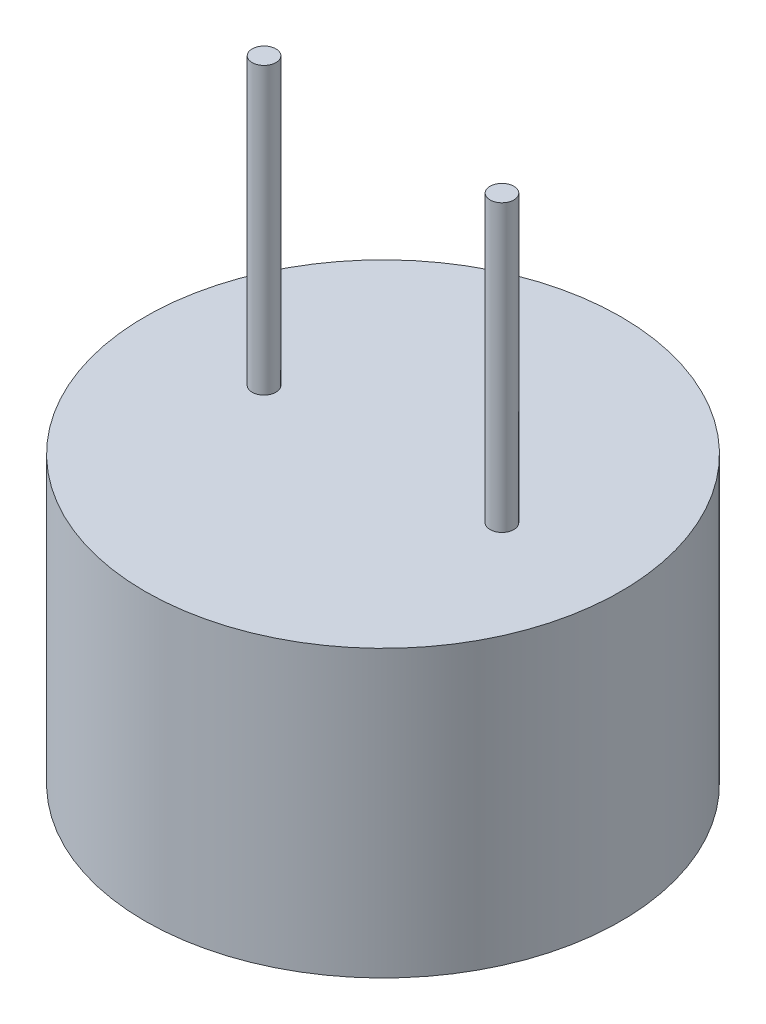
ISO-10303-21;
HEADER;
FILE_DESCRIPTION(('STEP AP214'),'2;1');
FILE_NAME('part.step','',(''),(''),'','','');
FILE_SCHEMA(('AUTOMOTIVE_DESIGN { 1 0 10303 214 1 1 1 1 }'));
ENDSEC;
DATA;
#1=APPLICATION_CONTEXT('core data for automotive mechanical design processes');
#2=APPLICATION_PROTOCOL_DEFINITION('international standard','automotive_design',2000,#1);
#3=PRODUCT_CONTEXT('',#1,'mechanical');
#4=PRODUCT('Part','Part','',(#3));
#5=PRODUCT_RELATED_PRODUCT_CATEGORY('part','',(#4));
#6=PRODUCT_DEFINITION_FORMATION('','',#4);
#7=PRODUCT_DEFINITION_CONTEXT('part definition',#1,'design');
#8=PRODUCT_DEFINITION('design','',#6,#7);
#9=PRODUCT_DEFINITION_SHAPE('','',#8);
#10=(LENGTH_UNIT() NAMED_UNIT(*) SI_UNIT(.MILLI.,.METRE.));
#11=(NAMED_UNIT(*) PLANE_ANGLE_UNIT() SI_UNIT($,.RADIAN.));
#12=(NAMED_UNIT(*) SI_UNIT($,.STERADIAN.) SOLID_ANGLE_UNIT());
#13=UNCERTAINTY_MEASURE_WITH_UNIT(LENGTH_MEASURE(1.E-05),#10,'distance_accuracy_value','');
#14=(GEOMETRIC_REPRESENTATION_CONTEXT(3) GLOBAL_UNCERTAINTY_ASSIGNED_CONTEXT((#13)) GLOBAL_UNIT_ASSIGNED_CONTEXT((#10,
#11,#12)) REPRESENTATION_CONTEXT('',''));
#15=CARTESIAN_POINT('',(0.,0.,0.));
#16=DIRECTION('',(0.,0.,1.));
#17=DIRECTION('',(1.,0.,0.));
#18=AXIS2_PLACEMENT_3D('',#15,#16,#17);
#19=CARTESIAN_POINT('',(0.,6.,0.));
#20=DIRECTION('',(0.,-1.,0.));
#21=DIRECTION('',(0.,0.,-1.));
#22=AXIS2_PLACEMENT_3D('',#19,#20,#21);
#23=CYLINDRICAL_SURFACE('',#22,5.);
#24=CARTESIAN_POINT('',(0.,6.,0.));
#25=DIRECTION('',(0.,1.,0.));
#26=DIRECTION('',(0.,0.,1.));
#27=AXIS2_PLACEMENT_3D('',#24,#25,#26);
#28=CIRCLE('',#27,5.);
#29=CARTESIAN_POINT('',(0.,6.,5.));
#30=VERTEX_POINT('',#29);
#31=EDGE_CURVE('E10',#30,#30,#28,.T.);
#32=ORIENTED_EDGE('',*,*,#31,.F.);
#33=EDGE_LOOP('',(#32));
#34=FACE_BOUND('',#33,.T.);
#35=CARTESIAN_POINT('',(0.,0.,0.));
#36=DIRECTION('',(0.,1.,0.));
#37=DIRECTION('',(0.,0.,1.));
#38=AXIS2_PLACEMENT_3D('',#35,#36,#37);
#39=CIRCLE('',#38,5.);
#40=CARTESIAN_POINT('',(0.,0.,5.));
#41=VERTEX_POINT('',#40);
#42=EDGE_CURVE('E46',#41,#41,#39,.T.);
#43=ORIENTED_EDGE('',*,*,#42,.T.);
#44=EDGE_LOOP('',(#43));
#45=FACE_BOUND('',#44,.T.);
#46=ADVANCED_FACE('F43',(#34,#45),#23,.T.);
#47=CARTESIAN_POINT('',(0.,6.,0.));
#48=DIRECTION('',(0.,1.,0.));
#49=DIRECTION('',(0.,0.,1.));
#50=AXIS2_PLACEMENT_3D('',#47,#48,#49);
#51=PLANE('',#50);
#52=CARTESIAN_POINT('',(-2.5,6.,0.));
#53=DIRECTION('',(0.,1.,0.));
#54=DIRECTION('',(0.,0.,1.));
#55=AXIS2_PLACEMENT_3D('',#52,#53,#54);
#56=CIRCLE('',#55,0.25);
#57=CARTESIAN_POINT('',(-2.5,6.,0.25));
#58=VERTEX_POINT('',#57);
#59=EDGE_CURVE('E61',#58,#58,#56,.T.);
#60=ORIENTED_EDGE('',*,*,#59,.F.);
#61=EDGE_LOOP('',(#60));
#62=FACE_BOUND('',#61,.T.);
#63=CARTESIAN_POINT('',(2.5,6.,0.));
#64=DIRECTION('',(0.,1.,0.));
#65=DIRECTION('',(0.,0.,-1.));
#66=AXIS2_PLACEMENT_3D('',#63,#64,#65);
#67=CIRCLE('',#66,0.25);
#68=CARTESIAN_POINT('',(2.5,6.,-0.25));
#69=VERTEX_POINT('',#68);
#70=EDGE_CURVE('E58',#69,#69,#67,.T.);
#71=ORIENTED_EDGE('',*,*,#70,.F.);
#72=EDGE_LOOP('',(#71));
#73=FACE_BOUND('',#72,.T.);
#74=ORIENTED_EDGE('',*,*,#31,.T.);
#75=EDGE_LOOP('',(#74));
#76=FACE_BOUND('',#75,.T.);
#77=ADVANCED_FACE('F76',(#62,#73,#76),#51,.T.);
#78=CARTESIAN_POINT('',(0.,0.,0.));
#79=DIRECTION('',(0.,1.,0.));
#80=DIRECTION('',(0.,0.,1.));
#81=AXIS2_PLACEMENT_3D('',#78,#79,#80);
#82=PLANE('',#81);
#83=ORIENTED_EDGE('',*,*,#42,.F.);
#84=EDGE_LOOP('',(#83));
#85=FACE_BOUND('',#84,.T.);
#86=ADVANCED_FACE('F79',(#85),#82,.F.);
#87=CARTESIAN_POINT('',(2.5,12.,0.));
#88=DIRECTION('',(0.,-1.,0.));
#89=DIRECTION('',(0.,0.,-1.));
#90=AXIS2_PLACEMENT_3D('',#87,#88,#89);
#91=CYLINDRICAL_SURFACE('',#90,0.25);
#92=CARTESIAN_POINT('',(2.5,12.,0.));
#93=DIRECTION('',(0.,1.,0.));
#94=DIRECTION('',(0.,0.,-1.));
#95=AXIS2_PLACEMENT_3D('',#92,#93,#94);
#96=CIRCLE('',#95,0.25);
#97=CARTESIAN_POINT('',(2.5,12.,-0.25));
#98=VERTEX_POINT('',#97);
#99=EDGE_CURVE('E55',#98,#98,#96,.T.);
#100=ORIENTED_EDGE('',*,*,#99,.F.);
#101=EDGE_LOOP('',(#100));
#102=FACE_BOUND('',#101,.T.);
#103=ORIENTED_EDGE('',*,*,#70,.T.);
#104=EDGE_LOOP('',(#103));
#105=FACE_BOUND('',#104,.T.);
#106=ADVANCED_FACE('F83',(#102,#105),#91,.T.);
#107=CARTESIAN_POINT('',(2.5,12.,0.));
#108=DIRECTION('',(0.,-1.,0.));
#109=DIRECTION('',(0.,0.,-1.));
#110=AXIS2_PLACEMENT_3D('',#107,#108,#109);
#111=PLANE('',#110);
#112=ORIENTED_EDGE('',*,*,#99,.T.);
#113=EDGE_LOOP('',(#112));
#114=FACE_BOUND('',#113,.T.);
#115=ADVANCED_FACE('F72',(#114),#111,.F.);
#116=CARTESIAN_POINT('',(-2.5,12.,0.));
#117=DIRECTION('',(0.,-1.,0.));
#118=DIRECTION('',(0.,0.,-1.));
#119=AXIS2_PLACEMENT_3D('',#116,#117,#118);
#120=CYLINDRICAL_SURFACE('',#119,0.25);
#121=CARTESIAN_POINT('',(-2.5,12.,0.));
#122=DIRECTION('',(0.,1.,0.));
#123=DIRECTION('',(0.,0.,1.));
#124=AXIS2_PLACEMENT_3D('',#121,#122,#123);
#125=CIRCLE('',#124,0.25);
#126=CARTESIAN_POINT('',(-2.5,12.,0.25));
#127=VERTEX_POINT('',#126);
#128=EDGE_CURVE('E53',#127,#127,#125,.T.);
#129=ORIENTED_EDGE('',*,*,#128,.F.);
#130=EDGE_LOOP('',(#129));
#131=FACE_BOUND('',#130,.T.);
#132=ORIENTED_EDGE('',*,*,#59,.T.);
#133=EDGE_LOOP('',(#132));
#134=FACE_BOUND('',#133,.T.);
#135=ADVANCED_FACE('F69',(#131,#134),#120,.T.);
#136=CARTESIAN_POINT('',(-2.5,12.,0.));
#137=DIRECTION('',(0.,1.,0.));
#138=DIRECTION('',(0.,0.,1.));
#139=AXIS2_PLACEMENT_3D('',#136,#137,#138);
#140=PLANE('',#139);
#141=ORIENTED_EDGE('',*,*,#128,.T.);
#142=EDGE_LOOP('',(#141));
#143=FACE_BOUND('',#142,.T.);
#144=ADVANCED_FACE('F67',(#143),#140,.T.);
#145=CLOSED_SHELL('',(#46,#77,#86,#106,#115,#135,#144));
#146=MANIFOLD_SOLID_BREP('B2',#145);
#147=ADVANCED_BREP_SHAPE_REPRESENTATION('',(#18,#146),#14);
#148=SHAPE_DEFINITION_REPRESENTATION(#9,#147);
ENDSEC;
END-ISO-10303-21;
